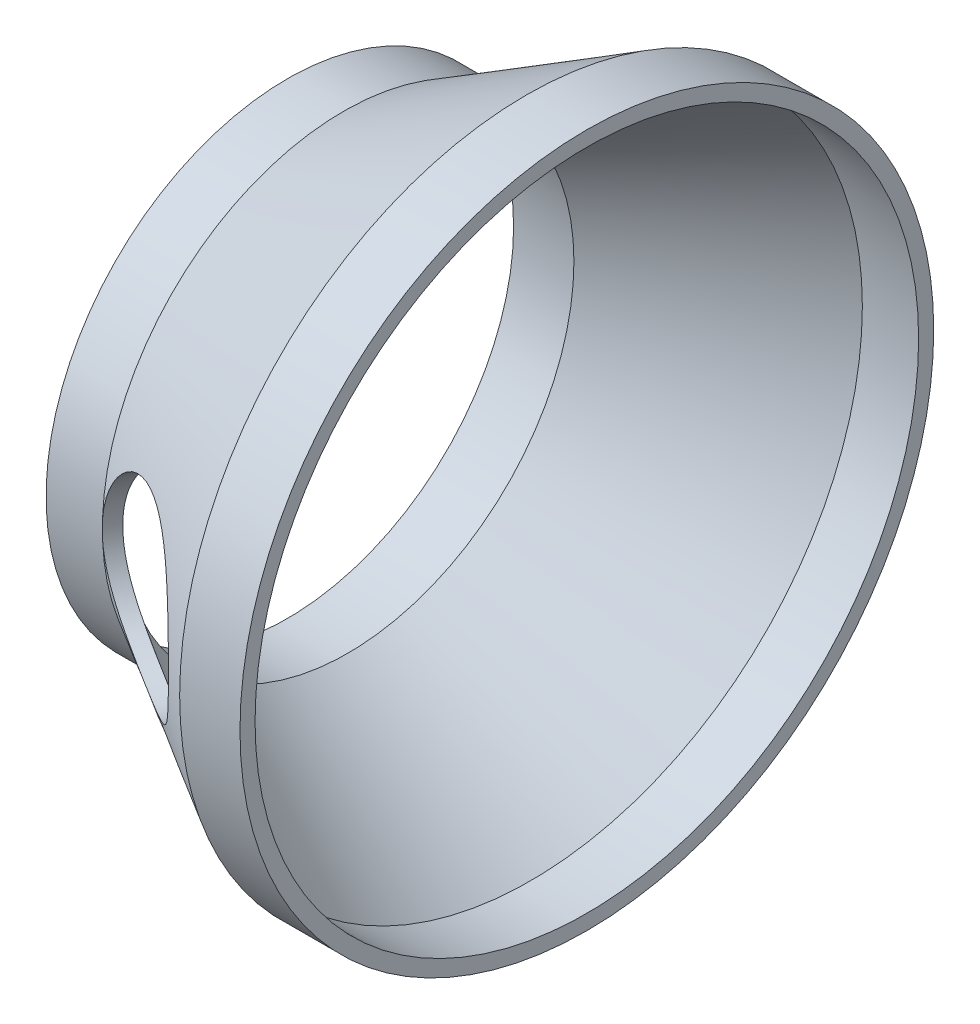
ISO-10303-21;
HEADER;
FILE_DESCRIPTION(('STEP AP214'),'2;1');
FILE_NAME('part.step','',(''),(''),'','','');
FILE_SCHEMA(('AUTOMOTIVE_DESIGN { 1 0 10303 214 1 1 1 1 }'));
ENDSEC;
DATA;
#1=APPLICATION_CONTEXT('core data for automotive mechanical design processes');
#2=APPLICATION_PROTOCOL_DEFINITION('international standard','automotive_design',2000,#1);
#3=PRODUCT_CONTEXT('',#1,'mechanical');
#4=PRODUCT('Part','Part','',(#3));
#5=PRODUCT_RELATED_PRODUCT_CATEGORY('part','',(#4));
#6=PRODUCT_DEFINITION_FORMATION('','',#4);
#7=PRODUCT_DEFINITION_CONTEXT('part definition',#1,'design');
#8=PRODUCT_DEFINITION('design','',#6,#7);
#9=PRODUCT_DEFINITION_SHAPE('','',#8);
#10=(LENGTH_UNIT() NAMED_UNIT(*) SI_UNIT(.MILLI.,.METRE.));
#11=(NAMED_UNIT(*) PLANE_ANGLE_UNIT() SI_UNIT($,.RADIAN.));
#12=(NAMED_UNIT(*) SI_UNIT($,.STERADIAN.) SOLID_ANGLE_UNIT());
#13=UNCERTAINTY_MEASURE_WITH_UNIT(LENGTH_MEASURE(1.E-05),#10,'distance_accuracy_value','');
#14=(GEOMETRIC_REPRESENTATION_CONTEXT(3) GLOBAL_UNCERTAINTY_ASSIGNED_CONTEXT((#13)) GLOBAL_UNIT_ASSIGNED_CONTEXT((#10,
#11,#12)) REPRESENTATION_CONTEXT('',''));
#15=CARTESIAN_POINT('',(0.,0.,0.));
#16=DIRECTION('',(0.,0.,1.));
#17=DIRECTION('',(1.,0.,0.));
#18=AXIS2_PLACEMENT_3D('',#15,#16,#17);
#19=CARTESIAN_POINT('',(0.,0.,0.));
#20=DIRECTION('',(1.,0.,0.));
#21=DIRECTION('',(0.,0.,-1.));
#22=AXIS2_PLACEMENT_3D('',#19,#20,#21);
#23=CYLINDRICAL_SURFACE('',#22,69.85);
#24=CARTESIAN_POINT('',(0.,0.,0.));
#25=DIRECTION('',(1.,0.,0.));
#26=DIRECTION('',(0.,0.,-1.));
#27=AXIS2_PLACEMENT_3D('',#24,#25,#26);
#28=CIRCLE('',#27,69.85);
#29=CARTESIAN_POINT('',(0.,0.,-69.85));
#30=VERTEX_POINT('',#29);
#31=EDGE_CURVE('E11',#30,#30,#28,.T.);
#32=ORIENTED_EDGE('',*,*,#31,.T.);
#33=EDGE_LOOP('',(#32));
#34=FACE_BOUND('',#33,.T.);
#35=CARTESIAN_POINT('',(-11.8492613140312,0.,0.));
#36=DIRECTION('',(1.,0.,0.));
#37=DIRECTION('',(0.,0.,-1.));
#38=AXIS2_PLACEMENT_3D('',#35,#36,#37);
#39=CIRCLE('',#38,69.85);
#40=CARTESIAN_POINT('',(-11.8492613140312,0.,-69.85));
#41=VERTEX_POINT('',#40);
#42=EDGE_CURVE('E109',#41,#41,#39,.T.);
#43=ORIENTED_EDGE('',*,*,#42,.F.);
#44=EDGE_LOOP('',(#43));
#45=FACE_BOUND('',#44,.T.);
#46=ADVANCED_FACE('F35',(#34,#45),#23,.F.);
#47=CARTESIAN_POINT('',(0.,69.85,0.));
#48=DIRECTION('',(1.,0.,0.));
#49=DIRECTION('',(0.,0.,-1.));
#50=AXIS2_PLACEMENT_3D('',#47,#48,#49);
#51=PLANE('',#50);
#52=CARTESIAN_POINT('',(0.,0.,0.));
#53=DIRECTION('',(1.,0.,0.));
#54=DIRECTION('',(0.,0.,-1.));
#55=AXIS2_PLACEMENT_3D('',#52,#53,#54);
#56=CIRCLE('',#55,73.025);
#57=CARTESIAN_POINT('',(0.,0.,-73.025));
#58=VERTEX_POINT('',#57);
#59=EDGE_CURVE('E42',#58,#58,#56,.T.);
#60=ORIENTED_EDGE('',*,*,#59,.T.);
#61=EDGE_LOOP('',(#60));
#62=FACE_BOUND('',#61,.T.);
#63=ORIENTED_EDGE('',*,*,#31,.F.);
#64=EDGE_LOOP('',(#63));
#65=FACE_BOUND('',#64,.T.);
#66=ADVANCED_FACE('F89',(#62,#65),#51,.T.);
#67=CARTESIAN_POINT('',(0.,0.,0.));
#68=DIRECTION('',(1.,0.,0.));
#69=DIRECTION('',(0.,0.,-1.));
#70=AXIS2_PLACEMENT_3D('',#67,#68,#69);
#71=CYLINDRICAL_SURFACE('',#70,73.025);
#72=CARTESIAN_POINT('',(-12.7,0.,0.));
#73=DIRECTION('',(1.,0.,0.));
#74=DIRECTION('',(0.,0.,-1.));
#75=AXIS2_PLACEMENT_3D('',#72,#73,#74);
#76=CIRCLE('',#75,73.025);
#77=CARTESIAN_POINT('',(-12.7,0.,-73.025));
#78=VERTEX_POINT('',#77);
#79=EDGE_CURVE('E77',#78,#78,#76,.T.);
#80=ORIENTED_EDGE('',*,*,#79,.T.);
#81=EDGE_LOOP('',(#80));
#82=FACE_BOUND('',#81,.T.);
#83=ORIENTED_EDGE('',*,*,#59,.F.);
#84=EDGE_LOOP('',(#83));
#85=FACE_BOUND('',#84,.T.);
#86=ADVANCED_FACE('F92',(#82,#85),#71,.T.);
#87=CARTESIAN_POINT('',(-12.7,0.,0.));
#88=DIRECTION('',(1.,0.,0.));
#89=DIRECTION('',(0.,0.,-1.));
#90=AXIS2_PLACEMENT_3D('',#87,#88,#89);
#91=CONICAL_SURFACE('',#90,73.025,0.523598775598301);
#92=CARTESIAN_POINT('',(-51.1950291982182,1.90827894883619,50.7640299790047));
#93=CARTESIAN_POINT('',(-51.1678004077634,2.17150763222859,50.7698703151976));
#94=CARTESIAN_POINT('',(-51.1349532500565,2.43409246611514,50.7769315430154));
#95=CARTESIAN_POINT('',(-51.0581453356805,2.9575447662264,50.7935516044977));
#96=CARTESIAN_POINT('',(-51.0141848965114,3.21841228129548,50.8031103668094));
#97=CARTESIAN_POINT('',(-50.8658682285422,3.99754006728916,50.8356057412339));
#98=CARTESIAN_POINT('',(-50.7450473694233,4.5126069566786,50.8623675459796));
#99=CARTESIAN_POINT('',(-50.4614693192118,5.52894101176478,50.926616330637));
#100=CARTESIAN_POINT('',(-50.2988138930157,6.03023844232981,50.9640773083101));
#101=CARTESIAN_POINT('',(-49.9334284858598,7.01701681330095,51.0505462826238));
#102=CARTESIAN_POINT('',(-49.7306963245275,7.50249689149026,51.0995549075414));
#103=CARTESIAN_POINT('',(-49.2876893121809,8.4540717608475,51.2100045383236));
#104=CARTESIAN_POINT('',(-49.0474428693509,8.92018088549064,51.2714361470228));
#105=CARTESIAN_POINT('',(-48.5318891359994,9.83050818441251,51.4077757953856));
#106=CARTESIAN_POINT('',(-48.2565820506985,10.2747264868038,51.482683756169));
#107=CARTESIAN_POINT('',(-47.6735177314208,11.1388106384676,51.6470830943238));
#108=CARTESIAN_POINT('',(-47.3657440973415,11.5586640124859,51.73658185464));
#109=CARTESIAN_POINT('',(-46.7207470508652,12.3712617857622,51.9311901735848));
#110=CARTESIAN_POINT('',(-46.3835230390742,12.7640056329772,52.0363000499719));
#111=CARTESIAN_POINT('',(-45.6721059049223,13.5313224053137,52.2665114636379));
#112=CARTESIAN_POINT('',(-45.2971078992345,13.9049984479127,52.3921175892421));
#113=CARTESIAN_POINT('',(-44.5224069894208,14.6185520469057,52.6618462566367));
#114=CARTESIAN_POINT('',(-44.1227035835929,14.9584289165611,52.8059691745188));
#115=CARTESIAN_POINT('',(-43.3021054675344,15.6019573225388,53.1133941598697));
#116=CARTESIAN_POINT('',(-42.881212214013,15.9056113442007,53.2766949099724));
#117=CARTESIAN_POINT('',(-42.0218142946006,16.4744337993993,53.6228343258317));
#118=CARTESIAN_POINT('',(-41.5833099256493,16.7396028814801,53.8056726622528));
#119=CARTESIAN_POINT('',(-40.694669312735,17.2280899821094,54.1898634039557));
#120=CARTESIAN_POINT('',(-40.2446038240786,17.4516146102574,54.3911165973855));
#121=CARTESIAN_POINT('',(-39.334449544519,17.8566075448263,54.8124343588997));
#122=CARTESIAN_POINT('',(-38.8743607514323,18.0380758420859,55.0324989310818));
#123=CARTESIAN_POINT('',(-37.9480596075016,18.357338325371,55.4904160663082));
#124=CARTESIAN_POINT('',(-37.4818486903522,18.4951425532935,55.7282645238256));
#125=CARTESIAN_POINT('',(-36.5469820455831,18.725907790067,56.2203357837311));
#126=CARTESIAN_POINT('',(-36.0783263937092,18.8188701800194,56.4745580815416));
#127=CARTESIAN_POINT('',(-35.1598100451809,18.956515178234,56.987654613572));
#128=CARTESIAN_POINT('',(-34.7099031545055,19.0028764624345,57.2459975243021));
#129=CARTESIAN_POINT('',(-33.8143962851637,19.0529673595208,57.7740096160391));
#130=CARTESIAN_POINT('',(-33.3687961940621,19.0566980883589,58.0436785003774));
#131=CARTESIAN_POINT('',(-32.4848663470871,19.0215622407223,58.5919943345527));
#132=CARTESIAN_POINT('',(-32.0465366153445,18.9826955228927,58.8706413141797));
#133=CARTESIAN_POINT('',(-31.1798921122197,18.862755350713,59.434345153118));
#134=CARTESIAN_POINT('',(-30.7515774273337,18.7816815319768,59.7194020677478));
#135=CARTESIAN_POINT('',(-29.9092961885298,18.5784819161825,60.2919661718554));
#136=CARTESIAN_POINT('',(-29.4952757886066,18.4565344102341,60.5794575229073));
#137=CARTESIAN_POINT('',(-28.6818978138833,18.1724932325226,61.1553242445065));
#138=CARTESIAN_POINT('',(-28.2825401334211,18.0103998501228,61.4436996086672));
#139=CARTESIAN_POINT('',(-27.5004559285823,17.6472715613048,62.0185674370459));
#140=CARTESIAN_POINT('',(-27.1177312743708,17.4462322897312,62.3050596864747));
#141=CARTESIAN_POINT('',(-26.3707705619961,17.0066526988267,62.8733390406609));
#142=CARTESIAN_POINT('',(-26.0065349403096,16.7681114947194,63.1551260342346));
#143=CARTESIAN_POINT('',(-25.2875424205885,16.2474170260585,63.7196051445372));
#144=CARTESIAN_POINT('',(-24.933400014518,15.964167922179,64.0020696222113));
#145=CARTESIAN_POINT('',(-24.2481202888548,15.3615222454657,64.5561383511078));
#146=CARTESIAN_POINT('',(-23.9169833880171,15.0421250149283,64.8277424046066));
#147=CARTESIAN_POINT('',(-23.2791858867385,14.3692587165911,65.3572690366997));
#148=CARTESIAN_POINT('',(-22.9725282463878,14.0157855396219,65.6151899594364));
#149=CARTESIAN_POINT('',(-22.385134600376,13.2770949674223,66.1145722202071));
#150=CARTESIAN_POINT('',(-22.1043987925554,12.8918773299545,66.3560334326136));
#151=CARTESIAN_POINT('',(-21.5648690485712,12.0842615160759,66.8244748594666));
#152=CARTESIAN_POINT('',(-21.3066190843706,11.661278541867,67.0510740780614));
#153=CARTESIAN_POINT('',(-20.8197331908167,10.7877242661603,67.4818309872873));
#154=CARTESIAN_POINT('',(-20.5910977408348,10.3371525182556,67.6859883146426));
#155=CARTESIAN_POINT('',(-20.1646541065986,9.41152870485799,68.069439463795));
#156=CARTESIAN_POINT('',(-19.9668443579239,8.93647788332002,68.2487345473131));
#157=CARTESIAN_POINT('',(-19.6031308287401,7.96519994504408,68.5802963525578));
#158=CARTESIAN_POINT('',(-19.4372264996768,7.46897319256599,68.7325635389753));
#159=CARTESIAN_POINT('',(-19.1401270107027,6.46513700813146,69.0064730866778));
#160=CARTESIAN_POINT('',(-19.0085284841912,5.95774384766828,69.128470451355));
#161=CARTESIAN_POINT('',(-18.77816182382,4.92940135538692,69.3427350961716));
#162=CARTESIAN_POINT('',(-18.6793935037024,4.40845210049561,69.4350025449798));
#163=CARTESIAN_POINT('',(-18.5153026723222,3.35688718570895,69.5886239452563));
#164=CARTESIAN_POINT('',(-18.4499757043995,2.82627282362812,69.6499820159365));
#165=CARTESIAN_POINT('',(-18.3531597947001,1.75927221953241,69.7410096987011));
#166=CARTESIAN_POINT('',(-18.3216702585973,1.22288607906114,69.770679867357));
#167=CARTESIAN_POINT('',(-18.2930722115959,0.161168288749678,69.7976236841836));
#168=CARTESIAN_POINT('',(-18.2951641318141,-0.364123006805756,69.7956507503745));
#169=CARTESIAN_POINT('',(-18.331771088983,-1.41256215450666,69.7611662272259));
#170=CARTESIAN_POINT('',(-18.3662855631081,-1.93571004370135,69.7286551679998));
#171=CARTESIAN_POINT('',(-18.4675249368369,-2.97609039244228,69.6335002528935));
#172=CARTESIAN_POINT('',(-18.5342486034372,-3.49332307765321,69.570857550486));
#173=CARTESIAN_POINT('',(-18.6995068609625,-4.51822584973166,69.4162095531806));
#174=CARTESIAN_POINT('',(-18.7980415757538,-5.02589589935593,69.3242041439499));
#175=CARTESIAN_POINT('',(-19.0258682187278,-6.02602310693457,69.1123905705245));
#176=CARTESIAN_POINT('',(-19.1550292162065,-6.51853520798239,68.9927008119639));
#177=CARTESIAN_POINT('',(-19.4436070867738,-7.48722990669248,68.7267170021483));
#178=CARTESIAN_POINT('',(-19.6030237843039,-7.96341259908712,68.5804231052639));
#179=CARTESIAN_POINT('',(-19.9512787040895,-8.89634620217336,68.2628963439227));
#180=CARTESIAN_POINT('',(-20.1401192981004,-9.35309554263003,68.0916614691352));
#181=CARTESIAN_POINT('',(-20.5462544703509,-10.2441841542783,67.7261752705504));
#182=CARTESIAN_POINT('',(-20.7635495415614,-10.6785230370293,67.531923547994));
#183=CARTESIAN_POINT('',(-21.2302100291807,-11.5305723213469,67.1183818225208));
#184=CARTESIAN_POINT('',(-21.4801346573998,-11.9477695179028,66.898665267543));
#185=CARTESIAN_POINT('',(-22.007295630506,-12.7532832422301,66.4399089111469));
#186=CARTESIAN_POINT('',(-22.284532310565,-13.1415994154727,66.2008688725986));
#187=CARTESIAN_POINT('',(-22.8650635050128,-13.8869039681391,65.7060184030941));
#188=CARTESIAN_POINT('',(-23.1683616077746,-14.2438880197494,65.4502056638731));
#189=CARTESIAN_POINT('',(-23.7995990923699,-14.9241606173042,64.9245578322482));
#190=CARTESIAN_POINT('',(-24.1275387384666,-15.2474488017954,64.6547225894724));
#191=CARTESIAN_POINT('',(-24.8133694157975,-15.8643115402755,64.0983452241537));
#192=CARTESIAN_POINT('',(-25.1717283955855,-16.1571622613481,63.8115768641452));
#193=CARTESIAN_POINT('',(-25.9108231025254,-16.703515513256,63.2294963173545));
#194=CARTESIAN_POINT('',(-26.2915591922194,-16.95701740634,62.934183992187));
#195=CARTESIAN_POINT('',(-27.0735100938352,-17.4227871450929,62.338206077542));
#196=CARTESIAN_POINT('',(-27.4747244770006,-17.6350558536192,62.0375406002299));
#197=CARTESIAN_POINT('',(-28.2955405481305,-18.0167002750502,61.4340852711595));
#198=CARTESIAN_POINT('',(-28.7151419517499,-18.186076650987,61.1312954523139));
#199=CARTESIAN_POINT('',(-29.5665362783369,-18.4791970451652,60.5295594044751));
#200=CARTESIAN_POINT('',(-29.9981850011605,-18.6033390886055,60.2306031490839));
#201=CARTESIAN_POINT('',(-30.8747102977702,-18.8070251047604,59.6368979215778));
#202=CARTESIAN_POINT('',(-31.3195868257275,-18.8865692319688,59.3421489348917));
#203=CARTESIAN_POINT('',(-32.2196510110778,-19.0002863881143,58.7599326719384));
#204=CARTESIAN_POINT('',(-32.6748363855715,-19.034469364287,58.4724638127813));
#205=CARTESIAN_POINT('',(-33.5925168472582,-19.0571138070858,57.9075724304296));
#206=CARTESIAN_POINT('',(-34.0550117335786,-19.0455765279801,57.6301496318469));
#207=CARTESIAN_POINT('',(-34.9691893440499,-18.9779155747466,57.0965393440551));
#208=CARTESIAN_POINT('',(-35.4207480559712,-18.9232217697271,56.8399570849422));
#209=CARTESIAN_POINT('',(-36.3243774876155,-18.7714363923907,56.3406249483702));
#210=CARTESIAN_POINT('',(-36.7764481952742,-18.674345799174,56.0978747516236));
#211=CARTESIAN_POINT('',(-37.6777492046816,-18.4385690075491,55.627870179699));
#212=CARTESIAN_POINT('',(-38.1269796539984,-18.2998849886044,55.4006149933601));
#213=CARTESIAN_POINT('',(-39.0192322226918,-17.9820627036982,54.9628333269433));
#214=CARTESIAN_POINT('',(-39.4622543165881,-17.802924271756,54.7523069155068));
#215=CARTESIAN_POINT('',(-40.3347969703798,-17.4074044977612,54.3506013279043));
#216=CARTESIAN_POINT('',(-40.7644024133494,-17.1913674516628,54.1592671604538));
#217=CARTESIAN_POINT('',(-41.6108999382361,-16.7226255829522,53.7942487747341));
#218=CARTESIAN_POINT('',(-42.0277921337424,-16.4699210880693,53.6205643987366));
#219=CARTESIAN_POINT('',(-42.8457184473495,-15.9296405317891,53.2908578069198));
#220=CARTESIAN_POINT('',(-43.2467508515989,-15.6420607152518,53.1348374965515));
#221=CARTESIAN_POINT('',(-44.0298145278406,-15.0340085274704,52.8401849770931));
#222=CARTESIAN_POINT('',(-44.4118453109175,-14.7135353105218,52.7015532152742));
#223=CARTESIAN_POINT('',(-45.1660417645504,-14.0307550004269,52.4368585518972));
#224=CARTESIAN_POINT('',(-45.5374759876345,-13.667422404793,52.3113551109966));
#225=CARTESIAN_POINT('',(-46.2536542573702,-12.9102411280215,52.0774582371655));
#226=CARTESIAN_POINT('',(-46.598397515255,-12.5163915457387,51.9690653097837));
#227=CARTESIAN_POINT('',(-47.2583203490064,-11.7003285071885,51.7683180971753));
#228=CARTESIAN_POINT('',(-47.5734821308884,-11.2780982379633,51.6759734372992));
#229=CARTESIAN_POINT('',(-48.0214975920679,-10.6257765516262,51.5487634055676));
#230=CARTESIAN_POINT('',(-48.1667180679644,-10.4051677495345,51.5082437173067));
#231=CARTESIAN_POINT('',(-48.4486303208442,-9.95786063518059,51.4308127158973));
#232=CARTESIAN_POINT('',(-48.5853197049229,-9.73116063966672,51.3939024135223));
#233=CARTESIAN_POINT('',(-48.9882871307878,-9.03159267047497,51.2867220677327));
#234=CARTESIAN_POINT('',(-49.2403539509683,-8.54957095652978,51.2219999196763));
#235=CARTESIAN_POINT('',(-49.7040862228632,-7.56491664695577,51.1060238325));
#236=CARTESIAN_POINT('',(-49.9157533066342,-7.06228488492251,51.0547693492857));
#237=CARTESIAN_POINT('',(-50.2007968891394,-6.29608261090088,50.9872547103688));
#238=CARTESIAN_POINT('',(-50.2903452570768,-6.03884275843843,50.9663235684018));
#239=CARTESIAN_POINT('',(-50.4584254028568,-5.52064197683493,50.927448500498));
#240=CARTESIAN_POINT('',(-50.5369596837637,-5.25968190805076,50.9095038956663));
#241=CARTESIAN_POINT('',(-50.7555805744965,-4.47208073577727,50.8600005715956));
#242=CARTESIAN_POINT('',(-50.8788310280833,-3.94032766105227,50.832738341264));
#243=CARTESIAN_POINT('',(-51.0248108568958,-3.15637457111821,50.8007975612081));
#244=CARTESIAN_POINT('',(-51.0659552267902,-2.90760785136784,50.791858038273));
#245=CARTESIAN_POINT('',(-51.1380963000184,-2.40885168695666,50.7762555072461));
#246=CARTESIAN_POINT('',(-51.1691055173393,-2.15886413990615,50.7695896913354));
#247=CARTESIAN_POINT('',(-51.1950291982182,-1.90827894883619,50.7640299790047));
#248=B_SPLINE_CURVE_WITH_KNOTS('',3,(#92,#93,#94,#95,#96,#97,#98,#99,#100,#101,#102,#103,#104,
#105,#106,#107,#108,#109,#110,#111,#112,#113,#114,#115,#116,#117,#118,#119,#120,#121,#122,#123,
#124,#125,#126,#127,#128,#129,#130,#131,#132,#133,#134,#135,#136,#137,#138,#139,#140,#141,#142,
#143,#144,#145,#146,#147,#148,#149,#150,#151,#152,#153,#154,#155,#156,#157,#158,#159,#160,#161,
#162,#163,#164,#165,#166,#167,#168,#169,#170,#171,#172,#173,#174,#175,#176,#177,#178,#179,#180,
#181,#182,#183,#184,#185,#186,#187,#188,#189,#190,#191,#192,#193,#194,#195,#196,#197,#198,#199,
#200,#201,#202,#203,#204,#205,#206,#207,#208,#209,#210,#211,#212,#213,#214,#215,#216,#217,#218,
#219,#220,#221,#222,#223,#224,#225,#226,#227,#228,#229,#230,#231,#232,#233,#234,#235,#236,#237,
#238,#239,#240,#241,#242,#243,#244,#245,#246,#247),.UNSPECIFIED.,.F.,.F.,(4,2,2,2,2,2,2,2,2,2,2,
2,2,2,2,2,2,2,2,2,2,2,2,2,2,2,2,2,2,2,2,2,2,2,2,2,2,2,2,2,2,2,2,2,2,2,2,2,2,2,2,2,2,2,2,2,2,2,2,
2,2,2,2,2,2,2,2,2,2,2,2,2,2,2,2,2,2,4),(0.,0.793960296465714,1.58789791250904,3.17492715246163,
4.75813177896995,6.34142256335349,7.9235201430218,9.50560846261322,11.0884998178759,
12.6714233967298,14.3017696272557,15.9321489767352,17.5624163974145,19.1926563418148,
20.8145793046199,22.4365026207386,24.0580526544607,25.6795527422352,27.2402892637747,
28.8009849293749,30.3616857739898,31.9224000928152,33.4763933010433,35.0303753087318,
36.5845315916015,38.1387245469083,39.739658180754,41.3406209477663,42.9417770146478,
44.5429453008551,46.1757907182105,47.8086625632022,49.4414515120938,51.074212385716,
52.6868079955634,54.2993944563958,55.9117659551684,57.5241091335204,59.0981208391277,
60.6721052218524,62.2460293554968,63.8199596177814,65.3872787622541,66.9545888126439,
68.5220252637307,70.0894888740858,71.6886190125998,73.2877687779876,74.8871390827293,
76.4865265420369,78.1179109399578,79.7493217759951,81.3806984689821,83.0120499425189,
84.6286788911705,86.2453022395426,87.8615710203621,89.4777954615217,91.0426113128783,
92.6073910287004,94.1720887655958,95.7367929224215,97.2876236780066,98.8384405733015,
100.389424598629,101.940448510461,103.54220677304,105.144012352451,106.746775363865,
107.548195365691,108.349839158576,109.991061933925,111.632218393604,112.451532332397,
113.270659770927,114.907662760711,115.664405333308,116.420209986232),.UNSPECIFIED.);
#249=CARTESIAN_POINT('',(-51.1948291982182,1.91021127597627,50.7640728555258));
#250=VERTEX_POINT('',#249);
#251=CARTESIAN_POINT('',(-51.1948291982182,-1.91021127597627,50.7640728555258));
#252=VERTEX_POINT('',#251);
#253=EDGE_CURVE('E62',#250,#252,#248,.T.);
#254=ORIENTED_EDGE('',*,*,#253,.T.);
#255=CARTESIAN_POINT('',(-51.1948291982182,0.,0.));
#256=DIRECTION('',(1.,0.,0.));
#257=DIRECTION('',(0.,0.,-1.));
#258=AXIS2_PLACEMENT_3D('',#255,#256,#257);
#259=CIRCLE('',#258,50.8);
#260=EDGE_CURVE('E73',#252,#250,#259,.T.);
#261=ORIENTED_EDGE('',*,*,#260,.T.);
#262=EDGE_LOOP('',(#254,#261));
#263=FACE_BOUND('',#262,.T.);
#264=ORIENTED_EDGE('',*,*,#79,.F.);
#265=EDGE_LOOP('',(#264));
#266=FACE_BOUND('',#265,.T.);
#267=ADVANCED_FACE('F75',(#263,#266),#91,.T.);
#268=CARTESIAN_POINT('',(0.,0.,0.));
#269=DIRECTION('',(1.,0.,0.));
#270=DIRECTION('',(0.,0.,-1.));
#271=AXIS2_PLACEMENT_3D('',#268,#269,#270);
#272=CYLINDRICAL_SURFACE('',#271,50.8);
#273=CARTESIAN_POINT('',(-51.2370967528826,1.57441036120125,50.7755968159365));
#274=CARTESIAN_POINT('',(-51.2307245236186,1.63046806349784,50.7738583417845));
#275=CARTESIAN_POINT('',(-51.2240161127645,1.68648032421071,50.7720287746743));
#276=CARTESIAN_POINT('',(-51.2099269278764,1.79841396246905,50.7681874545374));
#277=CARTESIAN_POINT('',(-51.2025461538423,1.85433534001452,50.7661757015107));
#278=CARTESIAN_POINT('',(-51.1948291982182,1.91021127597627,50.7640728555258));
#279=B_SPLINE_CURVE_WITH_KNOTS('',3,(#273,#274,#275,#276,#277,#278),.UNSPECIFIED.,.F.,.F.,(4,2,
4),(0.,0.169326639898994,0.338653279797988),.UNSPECIFIED.);
#280=CARTESIAN_POINT('',(-51.2370967528827,1.57441036120042,50.7755968159365));
#281=VERTEX_POINT('',#280);
#282=EDGE_CURVE('E64',#281,#250,#279,.T.);
#283=ORIENTED_EDGE('',*,*,#282,.T.);
#284=ORIENTED_EDGE('',*,*,#260,.F.);
#285=CARTESIAN_POINT('',(-51.1948291982182,-1.91021127597627,50.7640728555258));
#286=CARTESIAN_POINT('',(-51.2025461538423,-1.85433534001451,50.7661757015107));
#287=CARTESIAN_POINT('',(-51.2099269278764,-1.79841396246905,50.7681874545374));
#288=CARTESIAN_POINT('',(-51.2240161127645,-1.68648032421071,50.7720287746743));
#289=CARTESIAN_POINT('',(-51.2307245236186,-1.63046806349783,50.7738583417845));
#290=CARTESIAN_POINT('',(-51.2370967528826,-1.57441036120125,50.7755968159365));
#291=B_SPLINE_CURVE_WITH_KNOTS('',3,(#285,#286,#287,#288,#289,#290),.UNSPECIFIED.,.F.,.F.,(4,2,
4),(0.,0.169326639898995,0.338653279797989),.UNSPECIFIED.);
#292=CARTESIAN_POINT('',(-51.2370967528826,-1.57441036120082,50.7755968159365));
#293=VERTEX_POINT('',#292);
#294=EDGE_CURVE('E65',#252,#293,#291,.T.);
#295=ORIENTED_EDGE('',*,*,#294,.T.);
#296=CARTESIAN_POINT('',(-139.183010222717,0.,0.));
#297=DIRECTION('',(-0.500000000000002,0.,0.866025403784438));
#298=DIRECTION('',(0.866025403784438,0.,0.500000000000002));
#299=AXIS2_PLACEMENT_3D('',#296,#297,#298);
#300=ELLIPSE('',#299,101.6,50.8);
#301=EDGE_CURVE('E56',#293,#281,#300,.T.);
#302=ORIENTED_EDGE('',*,*,#301,.T.);
#303=EDGE_LOOP('',(#283,#284,#295,#302));
#304=FACE_BOUND('',#303,.T.);
#305=CARTESIAN_POINT('',(-63.0440905122494,0.,0.));
#306=DIRECTION('',(1.,0.,0.));
#307=DIRECTION('',(0.,0.,-1.));
#308=AXIS2_PLACEMENT_3D('',#305,#306,#307);
#309=CIRCLE('',#308,50.8);
#310=CARTESIAN_POINT('',(-63.0440905122494,0.,-50.8));
#311=VERTEX_POINT('',#310);
#312=EDGE_CURVE('E78',#311,#311,#309,.T.);
#313=ORIENTED_EDGE('',*,*,#312,.T.);
#314=EDGE_LOOP('',(#313));
#315=FACE_BOUND('',#314,.T.);
#316=ADVANCED_FACE('F71',(#304,#315),#272,.T.);
#317=CARTESIAN_POINT('',(-63.0440905122494,50.8,0.));
#318=DIRECTION('',(-1.,0.,0.));
#319=DIRECTION('',(0.,0.,1.));
#320=AXIS2_PLACEMENT_3D('',#317,#318,#319);
#321=PLANE('',#320);
#322=CARTESIAN_POINT('',(-63.0440905122494,0.,0.));
#323=DIRECTION('',(1.,0.,0.));
#324=DIRECTION('',(0.,0.,-1.));
#325=AXIS2_PLACEMENT_3D('',#322,#323,#324);
#326=CIRCLE('',#325,47.625);
#327=CARTESIAN_POINT('',(-63.0440905122494,0.,-47.625));
#328=VERTEX_POINT('',#327);
#329=EDGE_CURVE('E83',#328,#328,#326,.T.);
#330=ORIENTED_EDGE('',*,*,#329,.T.);
#331=EDGE_LOOP('',(#330));
#332=FACE_BOUND('',#331,.T.);
#333=ORIENTED_EDGE('',*,*,#312,.F.);
#334=EDGE_LOOP('',(#333));
#335=FACE_BOUND('',#334,.T.);
#336=ADVANCED_FACE('F125',(#332,#335),#321,.T.);
#337=CARTESIAN_POINT('',(0.,0.,0.));
#338=DIRECTION('',(1.,0.,0.));
#339=DIRECTION('',(0.,0.,-1.));
#340=AXIS2_PLACEMENT_3D('',#337,#338,#339);
#341=CYLINDRICAL_SURFACE('',#340,47.625);
#342=CARTESIAN_POINT('',(-50.3440905122494,0.,0.));
#343=DIRECTION('',(1.,0.,0.));
#344=DIRECTION('',(0.,0.,-1.));
#345=AXIS2_PLACEMENT_3D('',#342,#343,#344);
#346=CIRCLE('',#345,47.625);
#347=CARTESIAN_POINT('',(-50.3440905122494,0.,-47.625));
#348=VERTEX_POINT('',#347);
#349=EDGE_CURVE('E111',#348,#348,#346,.T.);
#350=ORIENTED_EDGE('',*,*,#349,.T.);
#351=EDGE_LOOP('',(#350));
#352=FACE_BOUND('',#351,.T.);
#353=ORIENTED_EDGE('',*,*,#329,.F.);
#354=EDGE_LOOP('',(#353));
#355=FACE_BOUND('',#354,.T.);
#356=ADVANCED_FACE('F128',(#352,#355),#341,.F.);
#357=CARTESIAN_POINT('',(-50.3440905122494,0.,0.));
#358=DIRECTION('',(1.,0.,0.));
#359=DIRECTION('',(0.,0.,-1.));
#360=AXIS2_PLACEMENT_3D('',#357,#358,#359);
#361=CONICAL_SURFACE('',#360,47.625,0.5235987755983);
#362=CARTESIAN_POINT('',(-44.7700161359534,-12.7417124429376,49.2207179264649));
#363=CARTESIAN_POINT('',(-44.4220622286787,-13.1353230676068,49.3263380794236));
#364=CARTESIAN_POINT('',(-44.059966492787,-13.5142088960085,49.440374267945));
#365=CARTESIAN_POINT('',(-43.3107265390349,-14.2401026514889,49.6863432020517));
#366=CARTESIAN_POINT('',(-42.9235807357788,-14.5871085575469,49.8182770809459));
#367=CARTESIAN_POINT('',(-42.1275026737666,-15.2469617259902,50.1009239958424));
#368=CARTESIAN_POINT('',(-41.7185668021627,-15.5598032974573,50.2516401515739));
#369=CARTESIAN_POINT('',(-40.8824080816208,-16.1490144379855,50.572403839194));
#370=CARTESIAN_POINT('',(-40.4551856339521,-16.4253848068049,50.7424509470319));
#371=CARTESIAN_POINT('',(-39.5852468349251,-16.9399821396177,51.1023914650834));
#372=CARTESIAN_POINT('',(-39.1425054332195,-17.1781436131102,51.2923180476348));
#373=CARTESIAN_POINT('',(-38.2458729709823,-17.6138065402414,51.6915497929544));
#374=CARTESIAN_POINT('',(-37.791981846967,-17.8113077623113,51.9008550660786));
#375=CARTESIAN_POINT('',(-36.8768942733939,-18.1639046120982,52.3380714827729));
#376=CARTESIAN_POINT('',(-36.4156996771468,-18.3190108210695,52.5659779652436));
#377=CARTESIAN_POINT('',(-35.4896380684465,-18.5855049353667,53.0392181044077));
#378=CARTESIAN_POINT('',(-35.0247711597882,-18.6968940718419,53.2845512701054));
#379=CARTESIAN_POINT('',(-34.1092157125528,-18.872257990261,53.7832102459442));
#380=CARTESIAN_POINT('',(-33.6585268157984,-18.9375742570363,54.0360646430329));
#381=CARTESIAN_POINT('',(-32.7603814528436,-19.0256775087848,54.5545829851532));
#382=CARTESIAN_POINT('',(-32.3129249233686,-19.0484653285255,54.8202466786532));
#383=CARTESIAN_POINT('',(-31.4242926789697,-19.0513847630237,55.3620956553905));
#384=CARTESIAN_POINT('',(-30.9831170030278,-19.0315161131512,55.6382810038911));
#385=CARTESIAN_POINT('',(-30.1098774758781,-18.9493697259667,56.1986238855743));
#386=CARTESIAN_POINT('',(-29.6778136605917,-18.8870918214993,56.482781450175));
#387=CARTESIAN_POINT('',(-28.829410319708,-18.7215055491669,57.0536255948765));
#388=CARTESIAN_POINT('',(-28.4129608973374,-18.618589848135,57.3402630181402));
#389=CARTESIAN_POINT('',(-27.5938095688262,-18.3725983572166,57.9159112016622));
#390=CARTESIAN_POINT('',(-27.1911075180076,-18.2295229901184,58.204921936904));
#391=CARTESIAN_POINT('',(-26.4014339686647,-17.9043104101902,58.7825399682799));
#392=CARTESIAN_POINT('',(-26.0144642077672,-17.7221688963832,59.0711472164679));
#393=CARTESIAN_POINT('',(-25.2581146463344,-17.3201579952506,59.6451164481175));
#394=CARTESIAN_POINT('',(-24.8887352968572,-17.1002876411361,59.9304783482183));
#395=CARTESIAN_POINT('',(-24.1578989333794,-16.6168411988538,60.5040466340904));
#396=CARTESIAN_POINT('',(-23.7970553858315,-16.3521090424022,60.7920607332878));
#397=CARTESIAN_POINT('',(-23.0974570914392,-15.7859349003316,61.3586809662939));
#398=CARTESIAN_POINT('',(-22.7587027506935,-15.4844922401008,61.6372869270935));
#399=CARTESIAN_POINT('',(-22.1047311859381,-14.8468491411596,62.1822206900016));
#400=CARTESIAN_POINT('',(-21.7895172776284,-14.5106438219269,62.4485467604583));
#401=CARTESIAN_POINT('',(-21.1840635568571,-13.8056757840844,62.9660733226723));
#402=CARTESIAN_POINT('',(-20.8938240197423,-13.4369127066105,63.2172736476564));
#403=CARTESIAN_POINT('',(-20.3327755592816,-12.6596920470928,63.7078428895665));
#404=CARTESIAN_POINT('',(-20.0626225932248,-12.2504796585218,63.9467670704057));
#405=CARTESIAN_POINT('',(-19.5512105530094,-11.4030523218948,64.4031746998828));
#406=CARTESIAN_POINT('',(-19.309952037002,-10.9648368138422,64.6206577343299));
#407=CARTESIAN_POINT('',(-18.8575659967368,-10.0623798529731,65.0316170600923));
#408=CARTESIAN_POINT('',(-18.6464374860956,-9.59813925284843,65.2250941372775));
#409=CARTESIAN_POINT('',(-18.2554367606149,-8.64682431162486,65.5857088055354));
#410=CARTESIAN_POINT('',(-18.0755640283962,-8.15975034865774,65.7528468325962));
#411=CARTESIAN_POINT('',(-17.7497462151258,-7.17123852414985,66.0571609911136));
#412=CARTESIAN_POINT('',(-17.6034763550211,-6.66999579092586,66.1946230904178));
#413=CARTESIAN_POINT('',(-17.3434100111083,-5.65207866194499,66.4399856081169));
#414=CARTESIAN_POINT('',(-17.2296134117537,-5.13540432110421,66.5478861316979));
#415=CARTESIAN_POINT('',(-17.0352021521918,-4.09048117674206,66.7327285269875));
#416=CARTESIAN_POINT('',(-16.9545826260337,-3.5622340825292,66.8096749385768));
#417=CARTESIAN_POINT('',(-16.8270120978009,-2.49804506905453,66.9316250177879));
#418=CARTESIAN_POINT('',(-16.7800603958458,-1.96210330998421,66.9766293494156));
#419=CARTESIAN_POINT('',(-16.7209124921213,-0.900705590611606,67.0333489809564));
#420=CARTESIAN_POINT('',(-16.7078370121191,-0.375343292538839,67.0459064357807));
#421=CARTESIAN_POINT('',(-16.7139758402208,0.675012543313079,67.04001447014));
#422=CARTESIAN_POINT('',(-16.7331895432898,1.20000608781753,67.0215656306711));
#423=CARTESIAN_POINT('',(-16.803784982492,2.24579644954021,66.9538964189623));
#424=CARTESIAN_POINT('',(-16.855164891327,2.76659350345062,66.9046777946929));
#425=CARTESIAN_POINT('',(-16.9897771719963,3.80028557391248,66.7760870642244));
#426=CARTESIAN_POINT('',(-17.073009591311,4.3131805786837,66.6967149130775));
#427=CARTESIAN_POINT('',(-17.2700429769896,5.3234071423417,66.5095462605051));
#428=CARTESIAN_POINT('',(-17.3835956593841,5.82083001519515,66.4019807524623));
#429=CARTESIAN_POINT('',(-17.6409156862501,6.80094380886502,66.159424134024));
#430=CARTESIAN_POINT('',(-17.7846827722673,7.28363485565713,66.0244332582255));
#431=CARTESIAN_POINT('',(-18.1016644180012,8.23112165026536,65.728587242785));
#432=CARTESIAN_POINT('',(-18.2748810895884,8.69591611175877,65.5677302482927));
#433=CARTESIAN_POINT('',(-18.6498628355149,9.60457753018237,65.2219831361308));
#434=CARTESIAN_POINT('',(-18.8516284191865,10.0484441135564,65.0370925896911));
#435=CARTESIAN_POINT('',(-19.2869371414358,10.9209005054113,64.6414879159675));
#436=CARTESIAN_POINT('',(-19.5210244300329,11.3490219867211,64.4303395923076));
#437=CARTESIAN_POINT('',(-20.0167161918954,12.1778517275588,63.987542827601));
#438=CARTESIAN_POINT('',(-20.2783209758221,12.5785596775149,63.7558941551184));
#439=CARTESIAN_POINT('',(-20.827879509721,13.3500783112453,63.274587668637));
#440=CARTESIAN_POINT('',(-21.1158371947064,13.7208845144917,63.0249271662951));
#441=CARTESIAN_POINT('',(-21.7167828986947,14.4301852796739,62.5102951430711));
#442=CARTESIAN_POINT('',(-22.0297712639746,14.7686793944587,62.2453234103859));
#443=CARTESIAN_POINT('',(-22.6871246810199,15.4188143951426,61.6964122493457));
#444=CARTESIAN_POINT('',(-23.0320582746318,15.7296268696009,61.4121718411516));
#445=CARTESIAN_POINT('',(-23.7451364850057,16.3129602783552,60.8336676745753));
#446=CARTESIAN_POINT('',(-24.113281530121,16.5854805056911,60.5394037312609));
#447=CARTESIAN_POINT('',(-24.871051594411,17.0902654190818,59.9440474568105));
#448=CARTESIAN_POINT('',(-25.2606770359142,17.32252931328,59.6429549914866));
#449=CARTESIAN_POINT('',(-26.0594755781981,17.7450218115053,59.0372197509743));
#450=CARTESIAN_POINT('',(-26.4686484346061,17.9352509408641,58.7325770202057));
#451=CARTESIAN_POINT('',(-27.3023971396969,18.2713234737349,58.1245041892448));
#452=CARTESIAN_POINT('',(-27.7268899659318,18.4173747986005,57.8210752574327));
#453=CARTESIAN_POINT('',(-28.5907358982975,18.6650470410011,57.217226024182));
#454=CARTESIAN_POINT('',(-29.0300890065808,18.7666679521003,56.9168057231794));
#455=CARTESIAN_POINT('',(-29.9208806199838,18.9245018288199,56.3222325934629));
#456=CARTESIAN_POINT('',(-30.3723162196164,18.9807256115509,56.0280782879775));
#457=CARTESIAN_POINT('',(-31.2844027291709,19.0472091440076,55.4490099886171));
#458=CARTESIAN_POINT('',(-31.7450533449553,19.0574703584853,55.1640957005651));
#459=CARTESIAN_POINT('',(-32.6565715098925,19.0322888994447,54.6157865981473));
#460=CARTESIAN_POINT('',(-33.1072402442685,18.9983860517636,54.3519895902836));
#461=CARTESIAN_POINT('',(-34.0109980125776,18.8877552945845,53.8378785331481));
#462=CARTESIAN_POINT('',(-34.4640869874876,18.8110284247692,53.5875641567064));
#463=CARTESIAN_POINT('',(-35.369330096858,18.6153858287413,53.1023277224386));
#464=CARTESIAN_POINT('',(-35.8214843214174,18.4964743795069,52.8674041070451));
#465=CARTESIAN_POINT('',(-36.7214915406321,18.217463408409,52.4143934104211));
#466=CARTESIAN_POINT('',(-37.1693445401993,18.0573639335865,52.1963063099619));
#467=CARTESIAN_POINT('',(-38.0501336484349,17.7002218134112,51.7813686219163));
#468=CARTESIAN_POINT('',(-38.483193837677,17.5038160201219,51.5842324652236));
#469=CARTESIAN_POINT('',(-39.3385349266067,17.073973769712,51.207802370437));
#470=CARTESIAN_POINT('',(-39.760815982729,16.8405378503553,51.0285081732977));
#471=CARTESIAN_POINT('',(-40.5914650848213,16.3383322991111,50.6878781319703));
#472=CARTESIAN_POINT('',(-40.999830907646,16.0695570543093,50.5265451480791));
#473=CARTESIAN_POINT('',(-41.7994684494401,15.4985797568639,50.2216490399059));
#474=CARTESIAN_POINT('',(-42.1907396673036,15.1963767252446,50.0780864363132));
#475=CARTESIAN_POINT('',(-42.9652869811999,14.5504093123771,49.8039176690766));
#476=CARTESIAN_POINT('',(-43.3479131487789,14.2056288701703,49.6738687061925));
#477=CARTESIAN_POINT('',(-44.0885187380579,13.4848481161971,49.4312920921074));
#478=CARTESIAN_POINT('',(-44.4464976911719,13.1088472111755,49.318764773972));
#479=CARTESIAN_POINT('',(-45.1347655838932,12.3278644162489,49.1101652761941));
#480=CARTESIAN_POINT('',(-45.4650475571126,11.9228752823739,49.0140972301137));
#481=CARTESIAN_POINT('',(-46.0947758224195,11.0864407873299,48.8372900515189));
#482=CARTESIAN_POINT('',(-46.3942220945065,10.6549954090011,48.7565509289472));
#483=CARTESIAN_POINT('',(-46.9683856900758,9.75401395217144,48.6068295079292));
#484=CARTESIAN_POINT('',(-47.2420048866287,9.28370073133261,48.5383061693347));
#485=CARTESIAN_POINT('',(-47.7501715137372,8.32066948089064,48.4149806743936));
#486=CARTESIAN_POINT('',(-47.9847179735482,7.82795089502317,48.3601788589352));
#487=CARTESIAN_POINT('',(-48.4117973480375,6.82356866180995,48.2630831605636));
#488=CARTESIAN_POINT('',(-48.6043408833882,6.31190984197057,48.2207861147869));
#489=CARTESIAN_POINT('',(-48.9449203818723,5.27319143444105,48.1476060106366));
#490=CARTESIAN_POINT('',(-49.092958214512,4.74613249466903,48.1167224728147));
#491=CARTESIAN_POINT('',(-49.3387423876837,3.69630923484768,48.0662524523843));
#492=CARTESIAN_POINT('',(-49.4378432661366,3.1738767474863,48.0463596357522));
#493=CARTESIAN_POINT('',(-49.590739612637,2.12214710022307,48.0159326420592));
#494=CARTESIAN_POINT('',(-49.6445358651171,1.59285005933954,48.0053983029596));
#495=CARTESIAN_POINT('',(-49.7060261494878,0.53158632059804,47.9933725631084));
#496=CARTESIAN_POINT('',(-49.7137293541199,-0.000379825004357694,47.9918793631254));
#497=CARTESIAN_POINT('',(-49.6829418084861,-1.06291244701402,47.9978852641025));
#498=CARTESIAN_POINT('',(-49.6444523454551,-1.59347896201139,48.0053841144844));
#499=CARTESIAN_POINT('',(-49.5245008859786,-2.62632928532585,48.0290794292289));
#500=CARTESIAN_POINT('',(-49.4449616822339,-3.12884680234281,48.0448872623958));
#501=CARTESIAN_POINT('',(-49.2451680648304,-4.12534079413331,48.0853687472827));
#502=CARTESIAN_POINT('',(-49.1249145639108,-4.61931746011604,48.1100422002527));
#503=CARTESIAN_POINT('',(-48.8452159877165,-5.59542320307299,48.1688732960135));
#504=CARTESIAN_POINT('',(-48.6857728788828,-6.07755287316645,48.2030304629452));
#505=CARTESIAN_POINT('',(-48.3295835007282,-7.02694977857048,48.2816186107032));
#506=CARTESIAN_POINT('',(-48.1328376703729,-7.49421718869951,48.3260494706335));
#507=CARTESIAN_POINT('',(-47.7143648107711,-8.38939973731012,48.4237384290431));
#508=CARTESIAN_POINT('',(-47.4942588138329,-8.81813090951952,48.4764798203625));
#509=CARTESIAN_POINT('',(-47.0241338126901,-9.65750184924157,48.5930201794672));
#510=CARTESIAN_POINT('',(-46.7741039582705,-10.0681349802177,48.6568231619051));
#511=CARTESIAN_POINT('',(-46.2463232421704,-10.8691372978529,48.7964010976119));
#512=CARTESIAN_POINT('',(-45.9685679512587,-11.2595032315689,48.87217796488));
#513=CARTESIAN_POINT('',(-45.3877293307197,-12.01782535607,49.0365848550211));
#514=CARTESIAN_POINT('',(-45.0846544299094,-12.3857889345659,49.1252106077093));
#515=CARTESIAN_POINT('',(-44.7700161359534,-12.7417124429376,49.2207179264649));
#516=B_SPLINE_CURVE_WITH_KNOTS('',3,(#362,#363,#364,#365,#366,#367,#368,#369,#370,#371,#372,
#373,#374,#375,#376,#377,#378,#379,#380,#381,#382,#383,#384,#385,#386,#387,#388,#389,#390,#391,
#392,#393,#394,#395,#396,#397,#398,#399,#400,#401,#402,#403,#404,#405,#406,#407,#408,#409,#410,
#411,#412,#413,#414,#415,#416,#417,#418,#419,#420,#421,#422,#423,#424,#425,#426,#427,#428,#429,
#430,#431,#432,#433,#434,#435,#436,#437,#438,#439,#440,#441,#442,#443,#444,#445,#446,#447,#448,
#449,#450,#451,#452,#453,#454,#455,#456,#457,#458,#459,#460,#461,#462,#463,#464,#465,#466,#467,
#468,#469,#470,#471,#472,#473,#474,#475,#476,#477,#478,#479,#480,#481,#482,#483,#484,#485,#486,
#487,#488,#489,#490,#491,#492,#493,#494,#495,#496,#497,#498,#499,#500,#501,#502,#503,#504,#505,
#506,#507,#508,#509,#510,#511,#512,#513,#514,#515),.UNSPECIFIED.,.T.,.F.,(4,2,2,2,2,2,2,2,2,2,2,
2,2,2,2,2,2,2,2,2,2,2,2,2,2,2,2,2,2,2,2,2,2,2,2,2,2,2,2,2,2,2,2,2,2,2,2,2,2,2,2,2,2,2,2,2,2,2,2,
2,2,2,2,2,2,2,2,2,2,2,2,2,2,2,2,2,4),(0.,1.60719878946838,3.21449939675038,4.82206733278498,
6.42960001142663,8.03985924360882,9.65012764631231,11.2599937788152,12.8698145714138,
14.4305767758548,15.991308344628,17.5520495958169,19.1127969986835,20.6588187320552,
22.2048241900138,23.7509999424838,25.2972153211046,26.8920072900119,28.4868285700896,
30.08187406077,31.6769371348507,33.3113486040602,34.9457916399403,36.5801811558338,
38.2145436149863,39.8323742701128,41.4501991685906,43.0677867024195,44.6853406091708,
46.2604688399795,47.8355675563608,49.4105768026333,50.9855883966719,52.5480784745415,
54.1105551874059,55.6731439949362,57.2357606836412,58.8289274529965,60.4221122104854,
62.0155352515686,63.6089803400379,65.2402591863165,66.871568145682,68.5029091898478,
70.1342298450883,71.7577488013225,73.3812679927262,75.0044002219109,76.6274807241544,
78.1954574290858,79.7633960682895,81.3311757839225,82.8989537089909,84.4414692714268,
85.9839624349825,87.5267008880037,89.06948453407,90.6613293791878,92.2532044796774,
93.8454787776346,95.4377541083638,97.0809883290497,98.7242633690732,100.367122415028,
102.009912441404,103.604249300239,105.19855855316,106.792550520201,108.386498069061,
109.911774780074,111.437017299465,112.96218330144,114.487331356895,115.940366356389,
117.393929823214,118.847725874434,120.301039875495),.UNSPECIFIED.);
#517=CARTESIAN_POINT('',(-44.7700161359534,-12.7417124429376,49.2207179264649));
#518=VERTEX_POINT('',#517);
#519=EDGE_CURVE('E69',#518,#518,#516,.T.);
#520=ORIENTED_EDGE('',*,*,#519,.T.);
#521=EDGE_LOOP('',(#520));
#522=FACE_BOUND('',#521,.T.);
#523=ORIENTED_EDGE('',*,*,#42,.T.);
#524=EDGE_LOOP('',(#523));
#525=FACE_BOUND('',#524,.T.);
#526=ORIENTED_EDGE('',*,*,#349,.F.);
#527=EDGE_LOOP('',(#526));
#528=FACE_BOUND('',#527,.T.);
#529=ADVANCED_FACE('F130',(#522,#525,#528),#361,.F.);
#530=CARTESIAN_POINT('',(-34.7957525556794,0.,60.2680113140311));
#531=DIRECTION('',(-0.500000000000002,0.,0.866025403784438));
#532=DIRECTION('',(0.866025403784438,0.,0.500000000000002));
#533=AXIS2_PLACEMENT_3D('',#530,#531,#532);
#534=PLANE('',#533);
#535=ORIENTED_EDGE('',*,*,#301,.F.);
#536=CARTESIAN_POINT('',(-34.7957525556794,0.,60.2680113140311));
#537=DIRECTION('',(-0.500000000000002,0.,0.866025403784438));
#538=DIRECTION('',(0.866025403784438,0.,0.500000000000002));
#539=AXIS2_PLACEMENT_3D('',#536,#537,#538);
#540=CIRCLE('',#539,19.05);
#541=EDGE_CURVE('E49',#281,#293,#540,.T.);
#542=ORIENTED_EDGE('',*,*,#541,.F.);
#543=EDGE_LOOP('',(#535,#542));
#544=FACE_BOUND('',#543,.T.);
#545=ADVANCED_FACE('F137',(#544),#534,.F.);
#546=CARTESIAN_POINT('',(31.6214355683813,0.,-54.7699330127018));
#547=DIRECTION('',(-0.500000000000002,0.,0.866025403784438));
#548=DIRECTION('',(0.866025403784438,0.,0.500000000000002));
#549=AXIS2_PLACEMENT_3D('',#546,#547,#548);
#550=CYLINDRICAL_SURFACE('',#549,19.05);
#551=ORIENTED_EDGE('',*,*,#519,.F.);
#552=EDGE_LOOP('',(#551));
#553=FACE_BOUND('',#552,.T.);
#554=ORIENTED_EDGE('',*,*,#541,.T.);
#555=ORIENTED_EDGE('',*,*,#294,.F.);
#556=ORIENTED_EDGE('',*,*,#253,.F.);
#557=ORIENTED_EDGE('',*,*,#282,.F.);
#558=EDGE_LOOP('',(#554,#555,#556,#557));
#559=FACE_BOUND('',#558,.T.);
#560=ADVANCED_FACE('F63',(#553,#559),#550,.F.);
#561=CLOSED_SHELL('',(#46,#66,#86,#267,#316,#336,#356,#529,#545,#560));
#562=MANIFOLD_SOLID_BREP('B2',#561);
#563=ADVANCED_BREP_SHAPE_REPRESENTATION('',(#18,#562),#14);
#564=SHAPE_DEFINITION_REPRESENTATION(#9,#563);
ENDSEC;
END-ISO-10303-21;
